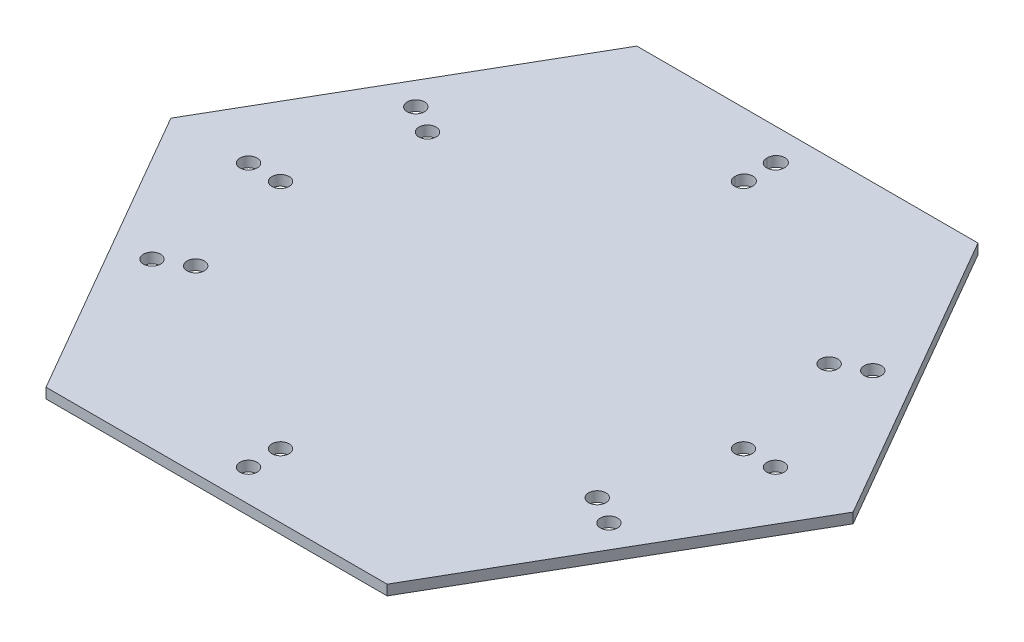
ISO-10303-21;
HEADER;
FILE_DESCRIPTION(('STEP AP214'),'2;1');
FILE_NAME('part.step','',(''),(''),'','','');
FILE_SCHEMA(('AUTOMOTIVE_DESIGN { 1 0 10303 214 1 1 1 1 }'));
ENDSEC;
DATA;
#1=APPLICATION_CONTEXT('core data for automotive mechanical design processes');
#2=APPLICATION_PROTOCOL_DEFINITION('international standard','automotive_design',2000,#1);
#3=PRODUCT_CONTEXT('',#1,'mechanical');
#4=PRODUCT('Part','Part','',(#3));
#5=PRODUCT_RELATED_PRODUCT_CATEGORY('part','',(#4));
#6=PRODUCT_DEFINITION_FORMATION('','',#4);
#7=PRODUCT_DEFINITION_CONTEXT('part definition',#1,'design');
#8=PRODUCT_DEFINITION('design','',#6,#7);
#9=PRODUCT_DEFINITION_SHAPE('','',#8);
#10=(LENGTH_UNIT() NAMED_UNIT(*) SI_UNIT(.MILLI.,.METRE.));
#11=(NAMED_UNIT(*) PLANE_ANGLE_UNIT() SI_UNIT($,.RADIAN.));
#12=(NAMED_UNIT(*) SI_UNIT($,.STERADIAN.) SOLID_ANGLE_UNIT());
#13=UNCERTAINTY_MEASURE_WITH_UNIT(LENGTH_MEASURE(1.E-05),#10,'distance_accuracy_value','');
#14=(GEOMETRIC_REPRESENTATION_CONTEXT(3) GLOBAL_UNCERTAINTY_ASSIGNED_CONTEXT((#13)) GLOBAL_UNIT_ASSIGNED_CONTEXT((#10,
#11,#12)) REPRESENTATION_CONTEXT('',''));
#15=CARTESIAN_POINT('',(0.,0.,0.));
#16=DIRECTION('',(0.,0.,1.));
#17=DIRECTION('',(1.,0.,0.));
#18=AXIS2_PLACEMENT_3D('',#15,#16,#17);
#19=CARTESIAN_POINT('',(80.0000000000013,4.78,138.564064605509));
#20=DIRECTION('',(-0.866025403784442,0.,-0.499999999999995));
#21=DIRECTION('',(-0.499999999999995,0.,0.866025403784442));
#22=AXIS2_PLACEMENT_3D('',#19,#20,#21);
#23=PLANE('',#22);
#24=DIRECTION('',(0.499999999999995,0.,-0.866025403784442));
#25=VECTOR('',#24,1.);
#26=CARTESIAN_POINT('',(80.0000000000013,0.,138.564064605509));
#27=LINE('',#26,#25);
#28=CARTESIAN_POINT('',(80.0000000000013,0.,138.564064605509));
#29=VERTEX_POINT('',#28);
#30=CARTESIAN_POINT('',(159.999999999999,0.,0.));
#31=VERTEX_POINT('',#30);
#32=EDGE_CURVE('E176',#29,#31,#27,.T.);
#33=ORIENTED_EDGE('',*,*,#32,.T.);
#34=DIRECTION('',(0.,-1.,0.));
#35=VECTOR('',#34,1.);
#36=CARTESIAN_POINT('',(159.999999999999,4.78,0.));
#37=LINE('',#36,#35);
#38=CARTESIAN_POINT('',(159.999999999999,4.78,0.));
#39=VERTEX_POINT('',#38);
#40=EDGE_CURVE('E221',#39,#31,#37,.T.);
#41=ORIENTED_EDGE('',*,*,#40,.F.);
#42=DIRECTION('',(0.499999999999995,0.,-0.866025403784442));
#43=VECTOR('',#42,1.);
#44=CARTESIAN_POINT('',(80.0000000000013,4.78,138.564064605509));
#45=LINE('',#44,#43);
#46=CARTESIAN_POINT('',(80.0000000000013,4.78,138.564064605509));
#47=VERTEX_POINT('',#46);
#48=EDGE_CURVE('E181',#47,#39,#45,.T.);
#49=ORIENTED_EDGE('',*,*,#48,.F.);
#50=DIRECTION('',(0.,-1.,0.));
#51=VECTOR('',#50,1.);
#52=CARTESIAN_POINT('',(80.0000000000013,4.78,138.564064605509));
#53=LINE('',#52,#51);
#54=EDGE_CURVE('E195',#47,#29,#53,.T.);
#55=ORIENTED_EDGE('',*,*,#54,.T.);
#56=EDGE_LOOP('',(#33,#41,#49,#55));
#57=FACE_BOUND('',#56,.T.);
#58=ADVANCED_FACE('F34',(#57),#23,.F.);
#59=CARTESIAN_POINT('',(159.999999999999,4.78,0.));
#60=DIRECTION('',(-0.866025403784438,0.,0.500000000000001));
#61=DIRECTION('',(0.500000000000001,0.,0.866025403784438));
#62=AXIS2_PLACEMENT_3D('',#59,#60,#61);
#63=PLANE('',#62);
#64=DIRECTION('',(-0.500000000000001,0.,-0.866025403784438));
#65=VECTOR('',#64,1.);
#66=CARTESIAN_POINT('',(159.999999999999,0.,0.));
#67=LINE('',#66,#65);
#68=CARTESIAN_POINT('',(79.9999999999994,0.,-138.56406460551));
#69=VERTEX_POINT('',#68);
#70=EDGE_CURVE('E198',#31,#69,#67,.T.);
#71=ORIENTED_EDGE('',*,*,#70,.T.);
#72=DIRECTION('',(0.,-1.,0.));
#73=VECTOR('',#72,1.);
#74=CARTESIAN_POINT('',(79.9999999999994,4.78,-138.56406460551));
#75=LINE('',#74,#73);
#76=CARTESIAN_POINT('',(79.9999999999994,4.78,-138.56406460551));
#77=VERTEX_POINT('',#76);
#78=EDGE_CURVE('E218',#77,#69,#75,.T.);
#79=ORIENTED_EDGE('',*,*,#78,.F.);
#80=DIRECTION('',(-0.500000000000001,0.,-0.866025403784438));
#81=VECTOR('',#80,1.);
#82=CARTESIAN_POINT('',(159.999999999999,4.78,0.));
#83=LINE('',#82,#81);
#84=EDGE_CURVE('E184',#39,#77,#83,.T.);
#85=ORIENTED_EDGE('',*,*,#84,.F.);
#86=ORIENTED_EDGE('',*,*,#40,.T.);
#87=EDGE_LOOP('',(#71,#79,#85,#86));
#88=FACE_BOUND('',#87,.T.);
#89=ADVANCED_FACE('F300',(#88),#63,.F.);
#90=CARTESIAN_POINT('',(79.9999999999994,4.78,-138.56406460551));
#91=DIRECTION('',(0.,0.,1.));
#92=DIRECTION('',(1.,0.,0.));
#93=AXIS2_PLACEMENT_3D('',#90,#91,#92);
#94=PLANE('',#93);
#95=DIRECTION('',(-1.,0.,0.));
#96=VECTOR('',#95,1.);
#97=CARTESIAN_POINT('',(79.9999999999994,0.,-138.56406460551));
#98=LINE('',#97,#96);
#99=CARTESIAN_POINT('',(-80.0000000000003,0.,-138.564064605509));
#100=VERTEX_POINT('',#99);
#101=EDGE_CURVE('E200',#69,#100,#98,.T.);
#102=ORIENTED_EDGE('',*,*,#101,.T.);
#103=DIRECTION('',(0.,-1.,0.));
#104=VECTOR('',#103,1.);
#105=CARTESIAN_POINT('',(-80.0000000000003,4.78,-138.564064605509));
#106=LINE('',#105,#104);
#107=CARTESIAN_POINT('',(-80.0000000000003,4.78,-138.564064605509));
#108=VERTEX_POINT('',#107);
#109=EDGE_CURVE('E215',#108,#100,#106,.T.);
#110=ORIENTED_EDGE('',*,*,#109,.F.);
#111=DIRECTION('',(-1.,0.,0.));
#112=VECTOR('',#111,1.);
#113=CARTESIAN_POINT('',(79.9999999999994,4.78,-138.56406460551));
#114=LINE('',#113,#112);
#115=EDGE_CURVE('E187',#77,#108,#114,.T.);
#116=ORIENTED_EDGE('',*,*,#115,.F.);
#117=ORIENTED_EDGE('',*,*,#78,.T.);
#118=EDGE_LOOP('',(#102,#110,#116,#117));
#119=FACE_BOUND('',#118,.T.);
#120=ADVANCED_FACE('F305',(#119),#94,.F.);
#121=CARTESIAN_POINT('',(-80.0000000000003,4.78,-138.564064605509));
#122=DIRECTION('',(0.866025403784442,0.,0.499999999999995));
#123=DIRECTION('',(0.499999999999995,0.,-0.866025403784442));
#124=AXIS2_PLACEMENT_3D('',#121,#122,#123);
#125=PLANE('',#124);
#126=DIRECTION('',(-0.499999999999995,0.,0.866025403784442));
#127=VECTOR('',#126,1.);
#128=CARTESIAN_POINT('',(-80.0000000000003,0.,-138.564064605509));
#129=LINE('',#128,#127);
#130=CARTESIAN_POINT('',(-159.999999999999,0.,1.1172740284298E-12));
#131=VERTEX_POINT('',#130);
#132=EDGE_CURVE('E202',#100,#131,#129,.T.);
#133=ORIENTED_EDGE('',*,*,#132,.T.);
#134=DIRECTION('',(0.,-1.,0.));
#135=VECTOR('',#134,1.);
#136=CARTESIAN_POINT('',(-159.999999999999,4.78,1.1172740284298E-12));
#137=LINE('',#136,#135);
#138=CARTESIAN_POINT('',(-159.999999999999,4.78,1.1172740284298E-12));
#139=VERTEX_POINT('',#138);
#140=EDGE_CURVE('E212',#139,#131,#137,.T.);
#141=ORIENTED_EDGE('',*,*,#140,.F.);
#142=DIRECTION('',(-0.499999999999995,0.,0.866025403784442));
#143=VECTOR('',#142,1.);
#144=CARTESIAN_POINT('',(-80.0000000000003,4.78,-138.564064605509));
#145=LINE('',#144,#143);
#146=EDGE_CURVE('E189',#108,#139,#145,.T.);
#147=ORIENTED_EDGE('',*,*,#146,.F.);
#148=ORIENTED_EDGE('',*,*,#109,.T.);
#149=EDGE_LOOP('',(#133,#141,#147,#148));
#150=FACE_BOUND('',#149,.T.);
#151=ADVANCED_FACE('F311',(#150),#125,.F.);
#152=CARTESIAN_POINT('',(-159.999999999999,4.78,1.1172740284298E-12));
#153=DIRECTION('',(0.866025403784435,0.,-0.500000000000007));
#154=DIRECTION('',(-0.500000000000007,0.,-0.866025403784435));
#155=AXIS2_PLACEMENT_3D('',#152,#153,#154);
#156=PLANE('',#155);
#157=DIRECTION('',(0.500000000000007,0.,0.866025403784435));
#158=VECTOR('',#157,1.);
#159=CARTESIAN_POINT('',(-159.999999999999,0.,1.1172740284298E-12));
#160=LINE('',#159,#158);
#161=CARTESIAN_POINT('',(-79.9999999999984,0.,138.56406460551));
#162=VERTEX_POINT('',#161);
#163=EDGE_CURVE('E204',#131,#162,#160,.T.);
#164=ORIENTED_EDGE('',*,*,#163,.T.);
#165=DIRECTION('',(0.,-1.,0.));
#166=VECTOR('',#165,1.);
#167=CARTESIAN_POINT('',(-79.9999999999984,4.78,138.56406460551));
#168=LINE('',#167,#166);
#169=CARTESIAN_POINT('',(-79.9999999999984,4.78,138.56406460551));
#170=VERTEX_POINT('',#169);
#171=EDGE_CURVE('E209',#170,#162,#168,.T.);
#172=ORIENTED_EDGE('',*,*,#171,.F.);
#173=DIRECTION('',(0.500000000000007,0.,0.866025403784435));
#174=VECTOR('',#173,1.);
#175=CARTESIAN_POINT('',(-159.999999999999,4.78,1.1172740284298E-12));
#176=LINE('',#175,#174);
#177=EDGE_CURVE('E191',#139,#170,#176,.T.);
#178=ORIENTED_EDGE('',*,*,#177,.F.);
#179=ORIENTED_EDGE('',*,*,#140,.T.);
#180=EDGE_LOOP('',(#164,#172,#178,#179));
#181=FACE_BOUND('',#180,.T.);
#182=ADVANCED_FACE('F315',(#181),#156,.F.);
#183=CARTESIAN_POINT('',(-79.9999999999984,4.78,138.56406460551));
#184=DIRECTION('',(0.,0.,-1.));
#185=DIRECTION('',(-1.,0.,0.));
#186=AXIS2_PLACEMENT_3D('',#183,#184,#185);
#187=PLANE('',#186);
#188=DIRECTION('',(1.,0.,0.));
#189=VECTOR('',#188,1.);
#190=CARTESIAN_POINT('',(-79.9999999999984,0.,138.56406460551));
#191=LINE('',#190,#189);
#192=EDGE_CURVE('E185',#162,#29,#191,.T.);
#193=ORIENTED_EDGE('',*,*,#192,.T.);
#194=ORIENTED_EDGE('',*,*,#54,.F.);
#195=DIRECTION('',(1.,0.,0.));
#196=VECTOR('',#195,1.);
#197=CARTESIAN_POINT('',(-79.9999999999984,4.78,138.56406460551));
#198=LINE('',#197,#196);
#199=EDGE_CURVE('E193',#170,#47,#198,.T.);
#200=ORIENTED_EDGE('',*,*,#199,.F.);
#201=ORIENTED_EDGE('',*,*,#171,.T.);
#202=EDGE_LOOP('',(#193,#194,#200,#201));
#203=FACE_BOUND('',#202,.T.);
#204=ADVANCED_FACE('F281',(#203),#187,.F.);
#205=CARTESIAN_POINT('',(0.,4.78,0.));
#206=DIRECTION('',(0.,1.,0.));
#207=DIRECTION('',(0.,0.,1.));
#208=AXIS2_PLACEMENT_3D('',#205,#206,#207);
#209=PLANE('',#208);
#210=CARTESIAN_POINT('',(123.562374261083,4.78,0.00169034442690362));
#211=DIRECTION('',(0.,1.,0.));
#212=DIRECTION('',(1.,0.,0.));
#213=AXIS2_PLACEMENT_3D('',#210,#211,#212);
#214=CIRCLE('',#213,4.05);
#215=CARTESIAN_POINT('',(127.612374261083,4.78,0.00169034442688948));
#216=VERTEX_POINT('',#215);
#217=EDGE_CURVE('E533',#216,#216,#214,.T.);
#218=ORIENTED_EDGE('',*,*,#217,.F.);
#219=EDGE_LOOP('',(#218));
#220=FACE_BOUND('',#219,.T.);
#221=CARTESIAN_POINT('',(-108.562374261083,4.78,0.00169034442822935));
#222=DIRECTION('',(0.,1.,0.));
#223=DIRECTION('',(-1.,0.,0.));
#224=AXIS2_PLACEMENT_3D('',#221,#222,#223);
#225=CIRCLE('',#224,4.05);
#226=CARTESIAN_POINT('',(-112.612374261083,4.78,0.00169034442827177));
#227=VERTEX_POINT('',#226);
#228=EDGE_CURVE('E538',#227,#227,#225,.T.);
#229=ORIENTED_EDGE('',*,*,#228,.F.);
#230=EDGE_LOOP('',(#229));
#231=FACE_BOUND('',#230,.T.);
#232=CARTESIAN_POINT('',(108.562374261083,4.78,0.00169034442695599));
#233=DIRECTION('',(0.,1.,0.));
#234=DIRECTION('',(1.,0.,0.));
#235=AXIS2_PLACEMENT_3D('',#232,#233,#234);
#236=CIRCLE('',#235,4.05);
#237=CARTESIAN_POINT('',(112.612374261083,4.78,0.00169034442694185));
#238=VERTEX_POINT('',#237);
#239=EDGE_CURVE('E231',#238,#238,#236,.T.);
#240=ORIENTED_EDGE('',*,*,#239,.F.);
#241=EDGE_LOOP('',(#240));
#242=FACE_BOUND('',#241,.T.);
#243=CARTESIAN_POINT('',(2.42819125812157E-13,4.78,-123.560683916656));
#244=DIRECTION('',(0.,1.,0.));
#245=DIRECTION('',(0.,0.,-1.));
#246=AXIS2_PLACEMENT_3D('',#243,#244,#245);
#247=CIRCLE('',#246,4.05);
#248=CARTESIAN_POINT('',(-4.04591694019126,4.78,-123.742497318449));
#249=VERTEX_POINT('',#248);
#250=CARTESIAN_POINT('',(4.04591694019174,4.78,-123.742497318449));
#251=VERTEX_POINT('',#250);
#252=EDGE_CURVE('E123',#249,#251,#247,.T.);
#253=ORIENTED_EDGE('',*,*,#252,.F.);
#254=CARTESIAN_POINT('',(2.40934936960218E-13,4.78,-123.924310720241));
#255=DIRECTION('',(0.,1.,0.));
#256=DIRECTION('',(0.,0.,-1.));
#257=AXIS2_PLACEMENT_3D('',#254,#255,#256);
#258=CIRCLE('',#257,4.05);
#259=EDGE_CURVE('E126',#251,#249,#258,.T.);
#260=ORIENTED_EDGE('',*,*,#259,.F.);
#261=EDGE_LOOP('',(#253,#260));
#262=FACE_BOUND('',#261,.T.);
#263=CARTESIAN_POINT('',(2.42819125812157E-13,4.78,-108.560683916656));
#264=DIRECTION('',(0.,1.,0.));
#265=DIRECTION('',(0.,0.,-1.));
#266=AXIS2_PLACEMENT_3D('',#263,#264,#265);
#267=CIRCLE('',#266,4.05);
#268=CARTESIAN_POINT('',(-4.04591694019126,4.78,-108.742497318449));
#269=VERTEX_POINT('',#268);
#270=CARTESIAN_POINT('',(4.04591694019174,4.78,-108.742497318449));
#271=VERTEX_POINT('',#270);
#272=EDGE_CURVE('E111',#269,#271,#267,.T.);
#273=ORIENTED_EDGE('',*,*,#272,.F.);
#274=CARTESIAN_POINT('',(2.40934936960218E-13,4.78,-108.924310720241));
#275=DIRECTION('',(0.,1.,0.));
#276=DIRECTION('',(0.,0.,-1.));
#277=AXIS2_PLACEMENT_3D('',#274,#275,#276);
#278=CIRCLE('',#277,4.05);
#279=EDGE_CURVE('E127',#271,#269,#278,.T.);
#280=ORIENTED_EDGE('',*,*,#279,.F.);
#281=EDGE_LOOP('',(#273,#280));
#282=FACE_BOUND('',#281,.T.);
#283=CARTESIAN_POINT('',(-123.562374261083,4.78,0.00169034442838646));
#284=DIRECTION('',(0.,1.,0.));
#285=DIRECTION('',(-1.,0.,0.));
#286=AXIS2_PLACEMENT_3D('',#283,#284,#285);
#287=CIRCLE('',#286,4.05);
#288=CARTESIAN_POINT('',(-127.612374261083,4.78,0.00169034442842889));
#289=VERTEX_POINT('',#288);
#290=EDGE_CURVE('E544',#289,#289,#287,.T.);
#291=ORIENTED_EDGE('',*,*,#290,.F.);
#292=EDGE_LOOP('',(#291));
#293=FACE_BOUND('',#292,.T.);
#294=CARTESIAN_POINT('',(-107.16561008672,4.78,-62.0522168888024));
#295=DIRECTION('',(0.,1.,0.));
#296=DIRECTION('',(-0.866025403784443,0.,-0.499999999999992));
#297=AXIS2_PLACEMENT_3D('',#294,#295,#296);
#298=CIRCLE('',#297,4.05);
#299=CARTESIAN_POINT('',(-110.673012972047,4.78,-64.0772168888024));
#300=VERTEX_POINT('',#299);
#301=EDGE_CURVE('E136',#300,#300,#298,.T.);
#302=ORIENTED_EDGE('',*,*,#301,.F.);
#303=EDGE_LOOP('',(#302));
#304=FACE_BOUND('',#303,.T.);
#305=CARTESIAN_POINT('',(-94.1752290299531,4.78,-54.5522168888026));
#306=DIRECTION('',(0.,1.,0.));
#307=DIRECTION('',(-0.866025403784443,0.,-0.499999999999992));
#308=AXIS2_PLACEMENT_3D('',#305,#306,#307);
#309=CIRCLE('',#308,4.05);
#310=CARTESIAN_POINT('',(-97.6826319152801,4.78,-56.5772168888025));
#311=VERTEX_POINT('',#310);
#312=EDGE_CURVE('E247',#311,#311,#309,.T.);
#313=ORIENTED_EDGE('',*,*,#312,.F.);
#314=EDGE_LOOP('',(#313));
#315=FACE_BOUND('',#314,.T.);
#316=CARTESIAN_POINT('',(-107.165610086719,4.78,61.6919707740736));
#317=DIRECTION('',(0.,1.,0.));
#318=DIRECTION('',(-0.866025403784433,0.,0.50000000000001));
#319=AXIS2_PLACEMENT_3D('',#316,#317,#318);
#320=CIRCLE('',#319,4.05);
#321=CARTESIAN_POINT('',(-110.673012972046,4.78,63.7169707740737));
#322=VERTEX_POINT('',#321);
#323=EDGE_CURVE('E246',#322,#322,#320,.T.);
#324=ORIENTED_EDGE('',*,*,#323,.F.);
#325=EDGE_LOOP('',(#324));
#326=FACE_BOUND('',#325,.T.);
#327=CARTESIAN_POINT('',(94.175229029953,4.78,54.1919707740724));
#328=DIRECTION('',(0.,1.,0.));
#329=DIRECTION('',(0.86602540378444,0.,0.499999999999998));
#330=AXIS2_PLACEMENT_3D('',#327,#328,#329);
#331=CIRCLE('',#330,4.05);
#332=CARTESIAN_POINT('',(97.68263191528,4.78,56.2169707740724));
#333=VERTEX_POINT('',#332);
#334=EDGE_CURVE('E151',#333,#333,#331,.T.);
#335=ORIENTED_EDGE('',*,*,#334,.F.);
#336=EDGE_LOOP('',(#335));
#337=FACE_BOUND('',#336,.T.);
#338=CARTESIAN_POINT('',(107.165610086719,4.78,-62.0522168888037));
#339=DIRECTION('',(0.,1.,0.));
#340=DIRECTION('',(0.866025403784436,0.,-0.500000000000004));
#341=AXIS2_PLACEMENT_3D('',#338,#339,#340);
#342=CIRCLE('',#341,4.05);
#343=CARTESIAN_POINT('',(110.673012972046,4.78,-64.0772168888038));
#344=VERTEX_POINT('',#343);
#345=EDGE_CURVE('E147',#344,#344,#342,.T.);
#346=ORIENTED_EDGE('',*,*,#345,.F.);
#347=EDGE_LOOP('',(#346));
#348=FACE_BOUND('',#347,.T.);
#349=CARTESIAN_POINT('',(94.1752290299527,4.78,-54.5522168888037));
#350=DIRECTION('',(0.,1.,0.));
#351=DIRECTION('',(0.866025403784436,0.,-0.500000000000004));
#352=AXIS2_PLACEMENT_3D('',#349,#350,#351);
#353=CIRCLE('',#352,4.05);
#354=CARTESIAN_POINT('',(97.6826319152797,4.78,-56.5772168888037));
#355=VERTEX_POINT('',#354);
#356=EDGE_CURVE('E142',#355,#355,#353,.T.);
#357=ORIENTED_EDGE('',*,*,#356,.F.);
#358=EDGE_LOOP('',(#357));
#359=FACE_BOUND('',#358,.T.);
#360=CARTESIAN_POINT('',(-94.1752290299521,4.78,54.1919707740735));
#361=DIRECTION('',(0.,1.,0.));
#362=DIRECTION('',(-0.866025403784433,0.,0.50000000000001));
#363=AXIS2_PLACEMENT_3D('',#360,#361,#362);
#364=CIRCLE('',#363,4.05);
#365=CARTESIAN_POINT('',(-97.682631915279,4.78,56.2169707740735));
#366=VERTEX_POINT('',#365);
#367=EDGE_CURVE('E239',#366,#366,#364,.T.);
#368=ORIENTED_EDGE('',*,*,#367,.F.);
#369=EDGE_LOOP('',(#368));
#370=FACE_BOUND('',#369,.T.);
#371=CARTESIAN_POINT('',(107.16561008672,4.78,61.6919707740723));
#372=DIRECTION('',(0.,1.,0.));
#373=DIRECTION('',(0.86602540378444,0.,0.499999999999998));
#374=AXIS2_PLACEMENT_3D('',#371,#372,#373);
#375=CIRCLE('',#374,4.05);
#376=CARTESIAN_POINT('',(110.673012972047,4.78,63.7169707740723));
#377=VERTEX_POINT('',#376);
#378=EDGE_CURVE('E158',#377,#377,#375,.T.);
#379=ORIENTED_EDGE('',*,*,#378,.F.);
#380=EDGE_LOOP('',(#379));
#381=FACE_BOUND('',#380,.T.);
#382=CARTESIAN_POINT('',(0.,4.78,123.56406460551));
#383=DIRECTION('',(0.,1.,0.));
#384=DIRECTION('',(0.,0.,1.));
#385=AXIS2_PLACEMENT_3D('',#382,#383,#384);
#386=CIRCLE('',#385,4.05);
#387=CARTESIAN_POINT('',(0.,4.78,127.61406460551));
#388=VERTEX_POINT('',#387);
#389=EDGE_CURVE('E169',#388,#388,#386,.T.);
#390=ORIENTED_EDGE('',*,*,#389,.F.);
#391=EDGE_LOOP('',(#390));
#392=FACE_BOUND('',#391,.T.);
#393=CARTESIAN_POINT('',(0.,4.78,108.56406460551));
#394=DIRECTION('',(0.,1.,0.));
#395=DIRECTION('',(0.,0.,1.));
#396=AXIS2_PLACEMENT_3D('',#393,#394,#395);
#397=CIRCLE('',#396,4.05);
#398=CARTESIAN_POINT('',(0.,4.78,112.61406460551));
#399=VERTEX_POINT('',#398);
#400=EDGE_CURVE('E168',#399,#399,#397,.T.);
#401=ORIENTED_EDGE('',*,*,#400,.F.);
#402=EDGE_LOOP('',(#401));
#403=FACE_BOUND('',#402,.T.);
#404=ORIENTED_EDGE('',*,*,#48,.T.);
#405=ORIENTED_EDGE('',*,*,#84,.T.);
#406=ORIENTED_EDGE('',*,*,#115,.T.);
#407=ORIENTED_EDGE('',*,*,#146,.T.);
#408=ORIENTED_EDGE('',*,*,#177,.T.);
#409=ORIENTED_EDGE('',*,*,#199,.T.);
#410=EDGE_LOOP('',(#404,#405,#406,#407,#408,#409));
#411=FACE_BOUND('',#410,.T.);
#412=ADVANCED_FACE('F263',(#220,#231,#242,#262,#282,#293,#304,#315,#326,#337,#348,#359,#370,
#381,#392,#403,#411),#209,.T.);
#413=CARTESIAN_POINT('',(0.,0.,0.));
#414=DIRECTION('',(0.,1.,0.));
#415=DIRECTION('',(0.,0.,1.));
#416=AXIS2_PLACEMENT_3D('',#413,#414,#415);
#417=PLANE('',#416);
#418=CARTESIAN_POINT('',(123.562374261083,0.,0.00169034442690362));
#419=DIRECTION('',(0.,1.,0.));
#420=DIRECTION('',(0.,0.,1.));
#421=AXIS2_PLACEMENT_3D('',#418,#419,#420);
#422=CIRCLE('',#421,4.05);
#423=CARTESIAN_POINT('',(123.562374261083,0.,4.0516903444269));
#424=VERTEX_POINT('',#423);
#425=EDGE_CURVE('E243',#424,#424,#422,.F.);
#426=ORIENTED_EDGE('',*,*,#425,.F.);
#427=EDGE_LOOP('',(#426));
#428=FACE_BOUND('',#427,.T.);
#429=CARTESIAN_POINT('',(-108.562374261083,0.,0.00169034442822935));
#430=DIRECTION('',(0.,1.,0.));
#431=DIRECTION('',(0.,0.,1.));
#432=AXIS2_PLACEMENT_3D('',#429,#430,#431);
#433=CIRCLE('',#432,4.05);
#434=CARTESIAN_POINT('',(-108.562374261083,0.,4.05169034442823));
#435=VERTEX_POINT('',#434);
#436=EDGE_CURVE('E541',#435,#435,#433,.F.);
#437=ORIENTED_EDGE('',*,*,#436,.F.);
#438=EDGE_LOOP('',(#437));
#439=FACE_BOUND('',#438,.T.);
#440=CARTESIAN_POINT('',(108.562374261083,0.,0.00169034442695599));
#441=DIRECTION('',(0.,1.,0.));
#442=DIRECTION('',(0.,0.,1.));
#443=AXIS2_PLACEMENT_3D('',#440,#441,#442);
#444=CIRCLE('',#443,4.05);
#445=CARTESIAN_POINT('',(108.562374261083,0.,4.05169034442695));
#446=VERTEX_POINT('',#445);
#447=EDGE_CURVE('E234',#446,#446,#444,.F.);
#448=ORIENTED_EDGE('',*,*,#447,.F.);
#449=EDGE_LOOP('',(#448));
#450=FACE_BOUND('',#449,.T.);
#451=CARTESIAN_POINT('',(-123.562374261083,0.,0.00169034442838646));
#452=DIRECTION('',(0.,1.,0.));
#453=DIRECTION('',(0.,0.,1.));
#454=AXIS2_PLACEMENT_3D('',#451,#452,#453);
#455=CIRCLE('',#454,4.05);
#456=CARTESIAN_POINT('',(-123.562374261083,0.,4.05169034442838));
#457=VERTEX_POINT('',#456);
#458=EDGE_CURVE('E545',#457,#457,#455,.F.);
#459=ORIENTED_EDGE('',*,*,#458,.F.);
#460=EDGE_LOOP('',(#459));
#461=FACE_BOUND('',#460,.T.);
#462=CARTESIAN_POINT('',(2.40934936960218E-13,0.,-108.924310720241));
#463=DIRECTION('',(0.,1.,0.));
#464=DIRECTION('',(0.,0.,1.));
#465=AXIS2_PLACEMENT_3D('',#462,#463,#464);
#466=CIRCLE('',#465,4.05);
#467=CARTESIAN_POINT('',(-4.04591694019126,0.,-108.742497318449));
#468=VERTEX_POINT('',#467);
#469=CARTESIAN_POINT('',(4.04591694019174,0.,-108.742497318449));
#470=VERTEX_POINT('',#469);
#471=EDGE_CURVE('E122',#468,#470,#466,.F.);
#472=ORIENTED_EDGE('',*,*,#471,.F.);
#473=CARTESIAN_POINT('',(2.42819125812157E-13,0.,-108.560683916656));
#474=DIRECTION('',(0.,1.,0.));
#475=DIRECTION('',(0.,0.,1.));
#476=AXIS2_PLACEMENT_3D('',#473,#474,#475);
#477=CIRCLE('',#476,4.05);
#478=EDGE_CURVE('E56',#470,#468,#477,.F.);
#479=ORIENTED_EDGE('',*,*,#478,.F.);
#480=EDGE_LOOP('',(#472,#479));
#481=FACE_BOUND('',#480,.T.);
#482=CARTESIAN_POINT('',(-107.16561008672,0.,-62.0522168888024));
#483=DIRECTION('',(0.,1.,0.));
#484=DIRECTION('',(0.,0.,1.));
#485=AXIS2_PLACEMENT_3D('',#482,#483,#484);
#486=CIRCLE('',#485,4.05);
#487=CARTESIAN_POINT('',(-107.16561008672,0.,-58.0022168888024));
#488=VERTEX_POINT('',#487);
#489=EDGE_CURVE('E132',#488,#488,#486,.F.);
#490=ORIENTED_EDGE('',*,*,#489,.F.);
#491=EDGE_LOOP('',(#490));
#492=FACE_BOUND('',#491,.T.);
#493=CARTESIAN_POINT('',(-94.1752290299531,0.,-54.5522168888026));
#494=DIRECTION('',(0.,1.,0.));
#495=DIRECTION('',(0.,0.,1.));
#496=AXIS2_PLACEMENT_3D('',#493,#494,#495);
#497=CIRCLE('',#496,4.05);
#498=CARTESIAN_POINT('',(-94.1752290299531,0.,-50.5022168888026));
#499=VERTEX_POINT('',#498);
#500=EDGE_CURVE('E139',#499,#499,#497,.F.);
#501=ORIENTED_EDGE('',*,*,#500,.F.);
#502=EDGE_LOOP('',(#501));
#503=FACE_BOUND('',#502,.T.);
#504=CARTESIAN_POINT('',(-107.165610086719,0.,61.6919707740736));
#505=DIRECTION('',(0.,1.,0.));
#506=DIRECTION('',(0.,0.,1.));
#507=AXIS2_PLACEMENT_3D('',#504,#505,#506);
#508=CIRCLE('',#507,4.05);
#509=CARTESIAN_POINT('',(-107.165610086719,0.,65.7419707740736));
#510=VERTEX_POINT('',#509);
#511=EDGE_CURVE('E250',#510,#510,#508,.F.);
#512=ORIENTED_EDGE('',*,*,#511,.F.);
#513=EDGE_LOOP('',(#512));
#514=FACE_BOUND('',#513,.T.);
#515=CARTESIAN_POINT('',(94.175229029953,0.,54.1919707740724));
#516=DIRECTION('',(0.,1.,0.));
#517=DIRECTION('',(0.,0.,1.));
#518=AXIS2_PLACEMENT_3D('',#515,#516,#517);
#519=CIRCLE('',#518,4.05);
#520=CARTESIAN_POINT('',(94.175229029953,0.,58.2419707740724));
#521=VERTEX_POINT('',#520);
#522=EDGE_CURVE('E154',#521,#521,#519,.F.);
#523=ORIENTED_EDGE('',*,*,#522,.F.);
#524=EDGE_LOOP('',(#523));
#525=FACE_BOUND('',#524,.T.);
#526=CARTESIAN_POINT('',(107.165610086719,0.,-62.0522168888037));
#527=DIRECTION('',(0.,1.,0.));
#528=DIRECTION('',(0.,0.,1.));
#529=AXIS2_PLACEMENT_3D('',#526,#527,#528);
#530=CIRCLE('',#529,4.05);
#531=CARTESIAN_POINT('',(107.165610086719,0.,-58.0022168888037));
#532=VERTEX_POINT('',#531);
#533=EDGE_CURVE('E155',#532,#532,#530,.F.);
#534=ORIENTED_EDGE('',*,*,#533,.F.);
#535=EDGE_LOOP('',(#534));
#536=FACE_BOUND('',#535,.T.);
#537=CARTESIAN_POINT('',(94.1752290299527,0.,-54.5522168888037));
#538=DIRECTION('',(0.,1.,0.));
#539=DIRECTION('',(0.,0.,1.));
#540=AXIS2_PLACEMENT_3D('',#537,#538,#539);
#541=CIRCLE('',#540,4.05);
#542=CARTESIAN_POINT('',(94.1752290299527,0.,-50.5022168888037));
#543=VERTEX_POINT('',#542);
#544=EDGE_CURVE('E145',#543,#543,#541,.F.);
#545=ORIENTED_EDGE('',*,*,#544,.F.);
#546=EDGE_LOOP('',(#545));
#547=FACE_BOUND('',#546,.T.);
#548=CARTESIAN_POINT('',(2.40934936960218E-13,0.,-123.924310720241));
#549=DIRECTION('',(0.,1.,0.));
#550=DIRECTION('',(0.,0.,1.));
#551=AXIS2_PLACEMENT_3D('',#548,#549,#550);
#552=CIRCLE('',#551,4.05);
#553=CARTESIAN_POINT('',(-4.04591694019126,0.,-123.742497318449));
#554=VERTEX_POINT('',#553);
#555=CARTESIAN_POINT('',(4.04591694019174,0.,-123.742497318449));
#556=VERTEX_POINT('',#555);
#557=EDGE_CURVE('E130',#554,#556,#552,.F.);
#558=ORIENTED_EDGE('',*,*,#557,.F.);
#559=CARTESIAN_POINT('',(2.42819125812157E-13,0.,-123.560683916656));
#560=DIRECTION('',(0.,1.,0.));
#561=DIRECTION('',(0.,0.,1.));
#562=AXIS2_PLACEMENT_3D('',#559,#560,#561);
#563=CIRCLE('',#562,4.05);
#564=EDGE_CURVE('E48',#556,#554,#563,.F.);
#565=ORIENTED_EDGE('',*,*,#564,.F.);
#566=EDGE_LOOP('',(#558,#565));
#567=FACE_BOUND('',#566,.T.);
#568=CARTESIAN_POINT('',(-94.1752290299521,0.,54.1919707740735));
#569=DIRECTION('',(0.,1.,0.));
#570=DIRECTION('',(0.,0.,1.));
#571=AXIS2_PLACEMENT_3D('',#568,#569,#570);
#572=CIRCLE('',#571,4.05);
#573=CARTESIAN_POINT('',(-94.1752290299521,0.,58.2419707740735));
#574=VERTEX_POINT('',#573);
#575=EDGE_CURVE('E242',#574,#574,#572,.F.);
#576=ORIENTED_EDGE('',*,*,#575,.F.);
#577=EDGE_LOOP('',(#576));
#578=FACE_BOUND('',#577,.T.);
#579=CARTESIAN_POINT('',(107.16561008672,0.,61.6919707740723));
#580=DIRECTION('',(0.,1.,0.));
#581=DIRECTION('',(0.,0.,1.));
#582=AXIS2_PLACEMENT_3D('',#579,#580,#581);
#583=CIRCLE('',#582,4.05);
#584=CARTESIAN_POINT('',(107.16561008672,0.,65.7419707740723));
#585=VERTEX_POINT('',#584);
#586=EDGE_CURVE('E165',#585,#585,#583,.F.);
#587=ORIENTED_EDGE('',*,*,#586,.F.);
#588=EDGE_LOOP('',(#587));
#589=FACE_BOUND('',#588,.T.);
#590=CARTESIAN_POINT('',(0.,0.,123.56406460551));
#591=DIRECTION('',(0.,1.,0.));
#592=DIRECTION('',(0.,0.,1.));
#593=AXIS2_PLACEMENT_3D('',#590,#591,#592);
#594=CIRCLE('',#593,4.05);
#595=CARTESIAN_POINT('',(0.,0.,127.61406460551));
#596=VERTEX_POINT('',#595);
#597=EDGE_CURVE('E172',#596,#596,#594,.F.);
#598=ORIENTED_EDGE('',*,*,#597,.F.);
#599=EDGE_LOOP('',(#598));
#600=FACE_BOUND('',#599,.T.);
#601=CARTESIAN_POINT('',(0.,0.,108.56406460551));
#602=DIRECTION('',(0.,1.,0.));
#603=DIRECTION('',(0.,0.,1.));
#604=AXIS2_PLACEMENT_3D('',#601,#602,#603);
#605=CIRCLE('',#604,4.05);
#606=CARTESIAN_POINT('',(0.,0.,112.61406460551));
#607=VERTEX_POINT('',#606);
#608=EDGE_CURVE('E173',#607,#607,#605,.F.);
#609=ORIENTED_EDGE('',*,*,#608,.F.);
#610=EDGE_LOOP('',(#609));
#611=FACE_BOUND('',#610,.T.);
#612=ORIENTED_EDGE('',*,*,#32,.F.);
#613=ORIENTED_EDGE('',*,*,#192,.F.);
#614=ORIENTED_EDGE('',*,*,#163,.F.);
#615=ORIENTED_EDGE('',*,*,#132,.F.);
#616=ORIENTED_EDGE('',*,*,#101,.F.);
#617=ORIENTED_EDGE('',*,*,#70,.F.);
#618=EDGE_LOOP('',(#612,#613,#614,#615,#616,#617));
#619=FACE_BOUND('',#618,.T.);
#620=ADVANCED_FACE('F120',(#428,#439,#450,#461,#481,#492,#503,#514,#525,#536,#547,#567,#578,
#589,#600,#611,#619),#417,.F.);
#621=CARTESIAN_POINT('',(0.,-11.4551298552221,108.56406460551));
#622=DIRECTION('',(0.,1.,0.));
#623=DIRECTION('',(0.,0.,1.));
#624=AXIS2_PLACEMENT_3D('',#621,#622,#623);
#625=CYLINDRICAL_SURFACE('',#624,4.05);
#626=ORIENTED_EDGE('',*,*,#608,.T.);
#627=EDGE_LOOP('',(#626));
#628=FACE_BOUND('',#627,.T.);
#629=ORIENTED_EDGE('',*,*,#400,.T.);
#630=EDGE_LOOP('',(#629));
#631=FACE_BOUND('',#630,.T.);
#632=ADVANCED_FACE('F262',(#628,#631),#625,.F.);
#633=CARTESIAN_POINT('',(0.,-11.4551298552221,123.56406460551));
#634=DIRECTION('',(0.,1.,0.));
#635=DIRECTION('',(0.,0.,1.));
#636=AXIS2_PLACEMENT_3D('',#633,#634,#635);
#637=CYLINDRICAL_SURFACE('',#636,4.05);
#638=ORIENTED_EDGE('',*,*,#597,.T.);
#639=EDGE_LOOP('',(#638));
#640=FACE_BOUND('',#639,.T.);
#641=ORIENTED_EDGE('',*,*,#389,.T.);
#642=EDGE_LOOP('',(#641));
#643=FACE_BOUND('',#642,.T.);
#644=ADVANCED_FACE('F357',(#640,#643),#637,.F.);
#645=CARTESIAN_POINT('',(107.16561008672,-11.4551298552221,61.6919707740723));
#646=DIRECTION('',(0.,1.,0.));
#647=DIRECTION('',(0.,0.,1.));
#648=AXIS2_PLACEMENT_3D('',#645,#646,#647);
#649=CYLINDRICAL_SURFACE('',#648,4.05);
#650=ORIENTED_EDGE('',*,*,#586,.T.);
#651=EDGE_LOOP('',(#650));
#652=FACE_BOUND('',#651,.T.);
#653=ORIENTED_EDGE('',*,*,#378,.T.);
#654=EDGE_LOOP('',(#653));
#655=FACE_BOUND('',#654,.T.);
#656=ADVANCED_FACE('F368',(#652,#655),#649,.F.);
#657=CARTESIAN_POINT('',(-94.1752290299521,-11.4551298552221,54.1919707740735));
#658=DIRECTION('',(0.,1.,0.));
#659=DIRECTION('',(0.,0.,1.));
#660=AXIS2_PLACEMENT_3D('',#657,#658,#659);
#661=CYLINDRICAL_SURFACE('',#660,4.05);
#662=ORIENTED_EDGE('',*,*,#575,.T.);
#663=EDGE_LOOP('',(#662));
#664=FACE_BOUND('',#663,.T.);
#665=ORIENTED_EDGE('',*,*,#367,.T.);
#666=EDGE_LOOP('',(#665));
#667=FACE_BOUND('',#666,.T.);
#668=ADVANCED_FACE('F378',(#664,#667),#661,.F.);
#669=CARTESIAN_POINT('',(2.40934936960218E-13,-11.4551298552221,-123.924310720241));
#670=DIRECTION('',(0.,1.,0.));
#671=DIRECTION('',(0.,0.,1.));
#672=AXIS2_PLACEMENT_3D('',#669,#670,#671);
#673=CYLINDRICAL_SURFACE('',#672,4.05);
#674=ORIENTED_EDGE('',*,*,#557,.T.);
#675=DIRECTION('',(0.,1.,0.));
#676=VECTOR('',#675,1.);
#677=CARTESIAN_POINT('',(4.04591694019174,2.39,-123.742497318449));
#678=LINE('',#677,#676);
#679=EDGE_CURVE('E11',#556,#251,#678,.T.);
#680=ORIENTED_EDGE('',*,*,#679,.T.);
#681=ORIENTED_EDGE('',*,*,#259,.T.);
#682=DIRECTION('',(0.,1.,0.));
#683=VECTOR('',#682,1.);
#684=CARTESIAN_POINT('',(-4.04591694019126,2.39,-123.742497318449));
#685=LINE('',#684,#683);
#686=EDGE_CURVE('E41',#249,#554,#685,.F.);
#687=ORIENTED_EDGE('',*,*,#686,.T.);
#688=EDGE_LOOP('',(#674,#680,#681,#687));
#689=FACE_BOUND('',#688,.T.);
#690=ADVANCED_FACE('F226',(#689),#673,.F.);
#691=CARTESIAN_POINT('',(94.1752290299527,-11.4551298552221,-54.5522168888037));
#692=DIRECTION('',(0.,1.,0.));
#693=DIRECTION('',(0.,0.,1.));
#694=AXIS2_PLACEMENT_3D('',#691,#692,#693);
#695=CYLINDRICAL_SURFACE('',#694,4.05);
#696=ORIENTED_EDGE('',*,*,#544,.T.);
#697=EDGE_LOOP('',(#696));
#698=FACE_BOUND('',#697,.T.);
#699=ORIENTED_EDGE('',*,*,#356,.T.);
#700=EDGE_LOOP('',(#699));
#701=FACE_BOUND('',#700,.T.);
#702=ADVANCED_FACE('F272',(#698,#701),#695,.F.);
#703=CARTESIAN_POINT('',(107.165610086719,-11.4551298552221,-62.0522168888037));
#704=DIRECTION('',(0.,1.,0.));
#705=DIRECTION('',(0.,0.,1.));
#706=AXIS2_PLACEMENT_3D('',#703,#704,#705);
#707=CYLINDRICAL_SURFACE('',#706,4.05);
#708=ORIENTED_EDGE('',*,*,#533,.T.);
#709=EDGE_LOOP('',(#708));
#710=FACE_BOUND('',#709,.T.);
#711=ORIENTED_EDGE('',*,*,#345,.T.);
#712=EDGE_LOOP('',(#711));
#713=FACE_BOUND('',#712,.T.);
#714=ADVANCED_FACE('F275',(#710,#713),#707,.F.);
#715=CARTESIAN_POINT('',(94.175229029953,-11.4551298552221,54.1919707740724));
#716=DIRECTION('',(0.,1.,0.));
#717=DIRECTION('',(0.,0.,1.));
#718=AXIS2_PLACEMENT_3D('',#715,#716,#717);
#719=CYLINDRICAL_SURFACE('',#718,4.05);
#720=ORIENTED_EDGE('',*,*,#522,.T.);
#721=EDGE_LOOP('',(#720));
#722=FACE_BOUND('',#721,.T.);
#723=ORIENTED_EDGE('',*,*,#334,.T.);
#724=EDGE_LOOP('',(#723));
#725=FACE_BOUND('',#724,.T.);
#726=ADVANCED_FACE('F405',(#722,#725),#719,.F.);
#727=CARTESIAN_POINT('',(-107.165610086719,-11.4551298552221,61.6919707740736));
#728=DIRECTION('',(0.,1.,0.));
#729=DIRECTION('',(0.,0.,1.));
#730=AXIS2_PLACEMENT_3D('',#727,#728,#729);
#731=CYLINDRICAL_SURFACE('',#730,4.05);
#732=ORIENTED_EDGE('',*,*,#511,.T.);
#733=EDGE_LOOP('',(#732));
#734=FACE_BOUND('',#733,.T.);
#735=ORIENTED_EDGE('',*,*,#323,.T.);
#736=EDGE_LOOP('',(#735));
#737=FACE_BOUND('',#736,.T.);
#738=ADVANCED_FACE('F257',(#734,#737),#731,.F.);
#739=CARTESIAN_POINT('',(-94.1752290299531,-11.4551298552221,-54.5522168888026));
#740=DIRECTION('',(0.,1.,0.));
#741=DIRECTION('',(0.,0.,1.));
#742=AXIS2_PLACEMENT_3D('',#739,#740,#741);
#743=CYLINDRICAL_SURFACE('',#742,4.05);
#744=ORIENTED_EDGE('',*,*,#500,.T.);
#745=EDGE_LOOP('',(#744));
#746=FACE_BOUND('',#745,.T.);
#747=ORIENTED_EDGE('',*,*,#312,.T.);
#748=EDGE_LOOP('',(#747));
#749=FACE_BOUND('',#748,.T.);
#750=ADVANCED_FACE('F424',(#746,#749),#743,.F.);
#751=CARTESIAN_POINT('',(-107.16561008672,-11.4551298552221,-62.0522168888024));
#752=DIRECTION('',(0.,1.,0.));
#753=DIRECTION('',(0.,0.,1.));
#754=AXIS2_PLACEMENT_3D('',#751,#752,#753);
#755=CYLINDRICAL_SURFACE('',#754,4.05);
#756=ORIENTED_EDGE('',*,*,#489,.T.);
#757=EDGE_LOOP('',(#756));
#758=FACE_BOUND('',#757,.T.);
#759=ORIENTED_EDGE('',*,*,#301,.T.);
#760=EDGE_LOOP('',(#759));
#761=FACE_BOUND('',#760,.T.);
#762=ADVANCED_FACE('F433',(#758,#761),#755,.F.);
#763=CARTESIAN_POINT('',(2.40934936960218E-13,-11.4551298552221,-108.924310720241));
#764=DIRECTION('',(0.,1.,0.));
#765=DIRECTION('',(0.,0.,1.));
#766=AXIS2_PLACEMENT_3D('',#763,#764,#765);
#767=CYLINDRICAL_SURFACE('',#766,4.05);
#768=ORIENTED_EDGE('',*,*,#471,.T.);
#769=DIRECTION('',(0.,1.,0.));
#770=VECTOR('',#769,1.);
#771=CARTESIAN_POINT('',(4.04591694019174,2.39,-108.742497318449));
#772=LINE('',#771,#770);
#773=EDGE_CURVE('E108',#470,#271,#772,.T.);
#774=ORIENTED_EDGE('',*,*,#773,.T.);
#775=ORIENTED_EDGE('',*,*,#279,.T.);
#776=DIRECTION('',(0.,1.,0.));
#777=VECTOR('',#776,1.);
#778=CARTESIAN_POINT('',(-4.04591694019126,2.39,-108.742497318449));
#779=LINE('',#778,#777);
#780=EDGE_CURVE('E116',#269,#468,#779,.F.);
#781=ORIENTED_EDGE('',*,*,#780,.T.);
#782=EDGE_LOOP('',(#768,#774,#775,#781));
#783=FACE_BOUND('',#782,.T.);
#784=ADVANCED_FACE('F125',(#783),#767,.F.);
#785=CARTESIAN_POINT('',(2.42819125812157E-13,-11.4551298552221,-108.560683916656));
#786=DIRECTION('',(0.,1.,0.));
#787=DIRECTION('',(0.,0.,1.));
#788=AXIS2_PLACEMENT_3D('',#785,#786,#787);
#789=CYLINDRICAL_SURFACE('',#788,4.05);
#790=ORIENTED_EDGE('',*,*,#478,.T.);
#791=ORIENTED_EDGE('',*,*,#780,.F.);
#792=ORIENTED_EDGE('',*,*,#272,.T.);
#793=ORIENTED_EDGE('',*,*,#773,.F.);
#794=EDGE_LOOP('',(#790,#791,#792,#793));
#795=FACE_BOUND('',#794,.T.);
#796=ADVANCED_FACE('F109',(#795),#789,.F.);
#797=CARTESIAN_POINT('',(2.42819125812157E-13,-11.4551298552221,-123.560683916656));
#798=DIRECTION('',(0.,1.,0.));
#799=DIRECTION('',(0.,0.,1.));
#800=AXIS2_PLACEMENT_3D('',#797,#798,#799);
#801=CYLINDRICAL_SURFACE('',#800,4.05);
#802=ORIENTED_EDGE('',*,*,#564,.T.);
#803=ORIENTED_EDGE('',*,*,#686,.F.);
#804=ORIENTED_EDGE('',*,*,#252,.T.);
#805=ORIENTED_EDGE('',*,*,#679,.F.);
#806=EDGE_LOOP('',(#802,#803,#804,#805));
#807=FACE_BOUND('',#806,.T.);
#808=ADVANCED_FACE('F476',(#807),#801,.F.);
#809=CARTESIAN_POINT('',(-123.562374261083,-11.4551298552221,0.00169034442838646));
#810=DIRECTION('',(0.,1.,0.));
#811=DIRECTION('',(0.,0.,1.));
#812=AXIS2_PLACEMENT_3D('',#809,#810,#811);
#813=CYLINDRICAL_SURFACE('',#812,4.05);
#814=ORIENTED_EDGE('',*,*,#458,.T.);
#815=EDGE_LOOP('',(#814));
#816=FACE_BOUND('',#815,.T.);
#817=ORIENTED_EDGE('',*,*,#290,.T.);
#818=EDGE_LOOP('',(#817));
#819=FACE_BOUND('',#818,.T.);
#820=ADVANCED_FACE('F485',(#816,#819),#813,.F.);
#821=CARTESIAN_POINT('',(108.562374261083,-11.4551298552221,0.00169034442695599));
#822=DIRECTION('',(0.,1.,0.));
#823=DIRECTION('',(0.,0.,1.));
#824=AXIS2_PLACEMENT_3D('',#821,#822,#823);
#825=CYLINDRICAL_SURFACE('',#824,4.05);
#826=ORIENTED_EDGE('',*,*,#447,.T.);
#827=EDGE_LOOP('',(#826));
#828=FACE_BOUND('',#827,.T.);
#829=ORIENTED_EDGE('',*,*,#239,.T.);
#830=EDGE_LOOP('',(#829));
#831=FACE_BOUND('',#830,.T.);
#832=ADVANCED_FACE('F494',(#828,#831),#825,.F.);
#833=CARTESIAN_POINT('',(-108.562374261083,-11.4551298552221,0.00169034442822935));
#834=DIRECTION('',(0.,1.,0.));
#835=DIRECTION('',(0.,0.,1.));
#836=AXIS2_PLACEMENT_3D('',#833,#834,#835);
#837=CYLINDRICAL_SURFACE('',#836,4.05);
#838=ORIENTED_EDGE('',*,*,#436,.T.);
#839=EDGE_LOOP('',(#838));
#840=FACE_BOUND('',#839,.T.);
#841=ORIENTED_EDGE('',*,*,#228,.T.);
#842=EDGE_LOOP('',(#841));
#843=FACE_BOUND('',#842,.T.);
#844=ADVANCED_FACE('F504',(#840,#843),#837,.F.);
#845=CARTESIAN_POINT('',(123.562374261083,-11.4551298552221,0.00169034442690362));
#846=DIRECTION('',(0.,1.,0.));
#847=DIRECTION('',(0.,0.,1.));
#848=AXIS2_PLACEMENT_3D('',#845,#846,#847);
#849=CYLINDRICAL_SURFACE('',#848,4.05);
#850=ORIENTED_EDGE('',*,*,#425,.T.);
#851=EDGE_LOOP('',(#850));
#852=FACE_BOUND('',#851,.T.);
#853=ORIENTED_EDGE('',*,*,#217,.T.);
#854=EDGE_LOOP('',(#853));
#855=FACE_BOUND('',#854,.T.);
#856=ADVANCED_FACE('F514',(#852,#855),#849,.F.);
#857=CLOSED_SHELL('',(#58,#89,#120,#151,#182,#204,#412,#620,#632,#644,#656,#668,#690,#702,#714,
#726,#738,#750,#762,#784,#796,#808,#820,#832,#844,#856));
#858=MANIFOLD_SOLID_BREP('B2',#857);
#859=ADVANCED_BREP_SHAPE_REPRESENTATION('',(#18,#858),#14);
#860=SHAPE_DEFINITION_REPRESENTATION(#9,#859);
ENDSEC;
END-ISO-10303-21;
